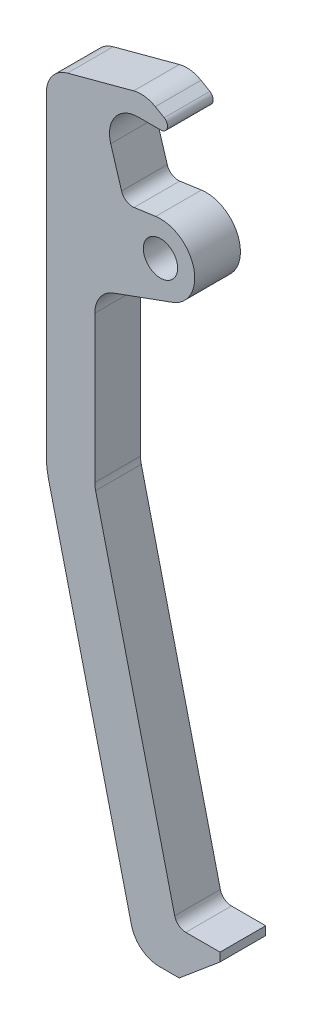
ISO-10303-21;
HEADER;
FILE_DESCRIPTION(('STEP AP214'),'2;1');
FILE_NAME('part.step','',(''),(''),'','','');
FILE_SCHEMA(('AUTOMOTIVE_DESIGN { 1 0 10303 214 1 1 1 1 }'));
ENDSEC;
DATA;
#1=APPLICATION_CONTEXT('core data for automotive mechanical design processes');
#2=APPLICATION_PROTOCOL_DEFINITION('international standard','automotive_design',2000,#1);
#3=PRODUCT_CONTEXT('',#1,'mechanical');
#4=PRODUCT('Part','Part','',(#3));
#5=PRODUCT_RELATED_PRODUCT_CATEGORY('part','',(#4));
#6=PRODUCT_DEFINITION_FORMATION('','',#4);
#7=PRODUCT_DEFINITION_CONTEXT('part definition',#1,'design');
#8=PRODUCT_DEFINITION('design','',#6,#7);
#9=PRODUCT_DEFINITION_SHAPE('','',#8);
#10=(LENGTH_UNIT() NAMED_UNIT(*) SI_UNIT(.MILLI.,.METRE.));
#11=(NAMED_UNIT(*) PLANE_ANGLE_UNIT() SI_UNIT($,.RADIAN.));
#12=(NAMED_UNIT(*) SI_UNIT($,.STERADIAN.) SOLID_ANGLE_UNIT());
#13=UNCERTAINTY_MEASURE_WITH_UNIT(LENGTH_MEASURE(1.E-05),#10,'distance_accuracy_value','');
#14=(GEOMETRIC_REPRESENTATION_CONTEXT(3) GLOBAL_UNCERTAINTY_ASSIGNED_CONTEXT((#13)) GLOBAL_UNIT_ASSIGNED_CONTEXT((#10,
#11,#12)) REPRESENTATION_CONTEXT('',''));
#15=CARTESIAN_POINT('',(0.,0.,0.));
#16=DIRECTION('',(0.,0.,1.));
#17=DIRECTION('',(1.,0.,0.));
#18=AXIS2_PLACEMENT_3D('',#15,#16,#17);
#19=CARTESIAN_POINT('',(-4.9,7.3919932770168,4.));
#20=DIRECTION('',(0.,0.,-1.));
#21=DIRECTION('',(-1.,0.,0.));
#22=AXIS2_PLACEMENT_3D('',#19,#20,#21);
#23=PLANE('',#22);
#24=CARTESIAN_POINT('',(-4.9,7.3919932770168,4.));
#25=DIRECTION('',(0.,0.,-1.));
#26=DIRECTION('',(-1.,0.,0.));
#27=AXIS2_PLACEMENT_3D('',#24,#25,#26);
#28=CIRCLE('',#27,2.);
#29=CARTESIAN_POINT('',(-4.6226908424842,5.41131166929741,4.));
#30=VERTEX_POINT('',#29);
#31=CARTESIAN_POINT('',(-6.81260951192607,6.80724986757133,4.));
#32=VERTEX_POINT('',#31);
#33=EDGE_CURVE('E284',#30,#32,#28,.T.);
#34=ORIENTED_EDGE('',*,*,#33,.T.);
#35=DIRECTION('',(-0.292371704722738,0.956304755963035,0.));
#36=VECTOR('',#35,1.);
#37=CARTESIAN_POINT('',(-6.81260951192607,6.80724986757133,4.));
#38=LINE('',#37,#36);
#39=CARTESIAN_POINT('',(-8.71302559262387,13.0232307813311,4.));
#40=VERTEX_POINT('',#39);
#41=EDGE_CURVE('E147',#32,#40,#38,.T.);
#42=ORIENTED_EDGE('',*,*,#41,.T.);
#43=CARTESIAN_POINT('',(-3.93150181280869,14.4850893049447,4.));
#44=DIRECTION('',(0.,0.,-1.));
#45=DIRECTION('',(-1.,0.,0.));
#46=AXIS2_PLACEMENT_3D('',#43,#44,#45);
#47=CIRCLE('',#46,5.);
#48=CARTESIAN_POINT('',(-3.93150181280869,19.4850893049447,4.));
#49=VERTEX_POINT('',#48);
#50=EDGE_CURVE('E350',#40,#49,#47,.T.);
#51=ORIENTED_EDGE('',*,*,#50,.T.);
#52=DIRECTION('',(1.,0.,0.));
#53=VECTOR('',#52,1.);
#54=CARTESIAN_POINT('',(-3.93150181280869,19.4850893049447,4.));
#55=LINE('',#54,#53);
#56=CARTESIAN_POINT('',(0.0684981871913097,19.4850893049447,4.));
#57=VERTEX_POINT('',#56);
#58=EDGE_CURVE('E369',#49,#57,#55,.T.);
#59=ORIENTED_EDGE('',*,*,#58,.T.);
#60=CARTESIAN_POINT('',(0.0684981871913078,20.6480042151237,4.));
#61=DIRECTION('',(0.,0.,1.));
#62=DIRECTION('',(1.,0.,0.));
#63=AXIS2_PLACEMENT_3D('',#60,#61,#62);
#64=CIRCLE('',#63,1.16291491017896);
#65=CARTESIAN_POINT('',(0.649955642280784,21.6551180697784,4.));
#66=VERTEX_POINT('',#65);
#67=EDGE_CURVE('E366',#57,#66,#64,.T.);
#68=ORIENTED_EDGE('',*,*,#67,.T.);
#69=DIRECTION('',(-0.86602540378444,0.499999999999997,0.));
#70=VECTOR('',#69,1.);
#71=CARTESIAN_POINT('',(0.649955642280784,21.6551180697784,4.));
#72=LINE('',#71,#70);
#73=CARTESIAN_POINT('',(-0.908890084531208,22.5551180697784,4.));
#74=VERTEX_POINT('',#73);
#75=EDGE_CURVE('E368',#66,#74,#72,.T.);
#76=ORIENTED_EDGE('',*,*,#75,.T.);
#77=CARTESIAN_POINT('',(-3.4088900845312,18.2249910508562,4.));
#78=DIRECTION('',(0.,0.,1.));
#79=DIRECTION('',(1.,0.,0.));
#80=AXIS2_PLACEMENT_3D('',#77,#78,#79);
#81=CIRCLE('',#80,5.);
#82=CARTESIAN_POINT('',(-4.70298531004382,23.0546201823015,4.));
#83=VERTEX_POINT('',#82);
#84=EDGE_CURVE('E371',#74,#83,#81,.T.);
#85=ORIENTED_EDGE('',*,*,#84,.T.);
#86=DIRECTION('',(-0.965925826289067,-0.258819045102525,0.));
#87=VECTOR('',#86,1.);
#88=CARTESIAN_POINT('',(-4.70298531004382,23.0546201823015,4.));
#89=LINE('',#88,#87);
#90=CARTESIAN_POINT('',(-16.2940952255126,19.9487916410712,4.));
#91=VERTEX_POINT('',#90);
#92=EDGE_CURVE('E377',#83,#91,#89,.T.);
#93=ORIENTED_EDGE('',*,*,#92,.T.);
#94=CARTESIAN_POINT('',(-15.,15.1191625096259,4.));
#95=DIRECTION('',(0.,0.,1.));
#96=DIRECTION('',(1.,0.,0.));
#97=AXIS2_PLACEMENT_3D('',#94,#95,#96);
#98=CIRCLE('',#97,5.);
#99=CARTESIAN_POINT('',(-20.,15.1191625096259,4.));
#100=VERTEX_POINT('',#99);
#101=EDGE_CURVE('E379',#91,#100,#98,.T.);
#102=ORIENTED_EDGE('',*,*,#101,.T.);
#103=DIRECTION('',(0.,-1.,0.));
#104=VECTOR('',#103,1.);
#105=CARTESIAN_POINT('',(-20.,15.1191625096259,4.));
#106=LINE('',#105,#104);
#107=CARTESIAN_POINT('',(-20.,-39.8808374903741,4.));
#108=VERTEX_POINT('',#107);
#109=EDGE_CURVE('E381',#100,#108,#106,.T.);
#110=ORIENTED_EDGE('',*,*,#109,.T.);
#111=CARTESIAN_POINT('',(-5.,-39.8808374903741,4.));
#112=DIRECTION('',(0.,0.,1.));
#113=DIRECTION('',(1.,0.,0.));
#114=AXIS2_PLACEMENT_3D('',#111,#112,#113);
#115=CIRCLE('',#114,15.);
#116=CARTESIAN_POINT('',(-19.5839110824137,-43.3893325438481,4.));
#117=VERTEX_POINT('',#116);
#118=EDGE_CURVE('E383',#108,#117,#115,.T.);
#119=ORIENTED_EDGE('',*,*,#118,.T.);
#120=DIRECTION('',(0.233899670231598,-0.972260738827579,0.));
#121=VECTOR('',#120,1.);
#122=CARTESIAN_POINT('',(-19.5839110824137,-43.3893325438481,4.));
#123=LINE('',#122,#121);
#124=CARTESIAN_POINT('',(-5.08213152805459,-103.669498351158,4.));
#125=VERTEX_POINT('',#124);
#126=EDGE_CURVE('E385',#117,#125,#123,.T.);
#127=ORIENTED_EDGE('',*,*,#126,.T.);
#128=CARTESIAN_POINT('',(-0.220827833916708,-102.5,4.));
#129=DIRECTION('',(0.,0.,1.));
#130=DIRECTION('',(1.,0.,0.));
#131=AXIS2_PLACEMENT_3D('',#128,#129,#130);
#132=CIRCLE('',#131,4.99999999999999);
#133=CARTESIAN_POINT('',(-0.220827833916708,-107.5,4.));
#134=VERTEX_POINT('',#133);
#135=EDGE_CURVE('E387',#125,#134,#132,.T.);
#136=ORIENTED_EDGE('',*,*,#135,.T.);
#137=DIRECTION('',(1.,0.,0.));
#138=VECTOR('',#137,1.);
#139=CARTESIAN_POINT('',(-0.220827833916708,-107.5,4.));
#140=LINE('',#139,#138);
#141=CARTESIAN_POINT('',(3.27917216608329,-107.5,4.));
#142=VERTEX_POINT('',#141);
#143=EDGE_CURVE('E389',#134,#142,#140,.T.);
#144=ORIENTED_EDGE('',*,*,#143,.T.);
#145=DIRECTION('',(0.766044443118981,0.642787609686535,0.));
#146=VECTOR('',#145,1.);
#147=CARTESIAN_POINT('',(3.27917216608329,-107.5,4.));
#148=LINE('',#147,#146);
#149=CARTESIAN_POINT('',(10.4296937216486,-101.5,4.));
#150=VERTEX_POINT('',#149);
#151=EDGE_CURVE('E391',#142,#150,#148,.T.);
#152=ORIENTED_EDGE('',*,*,#151,.T.);
#153=DIRECTION('',(0.,1.,0.));
#154=VECTOR('',#153,1.);
#155=CARTESIAN_POINT('',(10.4296937216486,-101.5,4.));
#156=LINE('',#155,#154);
#157=CARTESIAN_POINT('',(10.4296937216486,-100.,4.));
#158=VERTEX_POINT('',#157);
#159=EDGE_CURVE('E393',#150,#158,#156,.T.);
#160=ORIENTED_EDGE('',*,*,#159,.T.);
#161=DIRECTION('',(-1.,0.,0.));
#162=VECTOR('',#161,1.);
#163=CARTESIAN_POINT('',(10.4296937216486,-100.,4.));
#164=LINE('',#163,#162);
#165=CARTESIAN_POINT('',(4.42969372164859,-100.,4.));
#166=VERTEX_POINT('',#165);
#167=EDGE_CURVE('E395',#158,#166,#164,.T.);
#168=ORIENTED_EDGE('',*,*,#167,.T.);
#169=CARTESIAN_POINT('',(4.42969372164859,-98.,4.));
#170=DIRECTION('',(0.,0.,-1.));
#171=DIRECTION('',(-1.,0.,0.));
#172=AXIS2_PLACEMENT_3D('',#169,#170,#171);
#173=CIRCLE('',#172,2.);
#174=CARTESIAN_POINT('',(2.48517224399344,-98.4677993404632,4.));
#175=VERTEX_POINT('',#174);
#176=EDGE_CURVE('E397',#166,#175,#173,.T.);
#177=ORIENTED_EDGE('',*,*,#176,.T.);
#178=DIRECTION('',(-0.233899670231598,0.972260738827579,0.));
#179=VECTOR('',#178,1.);
#180=CARTESIAN_POINT('',(-11.3613036941379,-40.9115620339465,4.));
#181=LINE('',#180,#179);
#182=CARTESIAN_POINT('',(-11.3613036941379,-40.9115620339465,4.));
#183=VERTEX_POINT('',#182);
#184=EDGE_CURVE('E399',#175,#183,#181,.T.);
#185=ORIENTED_EDGE('',*,*,#184,.T.);
#186=CARTESIAN_POINT('',(-6.5,-39.7420636827885,4.));
#187=DIRECTION('',(0.,0.,-1.));
#188=DIRECTION('',(1.,0.,0.));
#189=AXIS2_PLACEMENT_3D('',#186,#187,#188);
#190=CIRCLE('',#189,5.);
#191=CARTESIAN_POINT('',(-11.5,-39.7420636827885,4.));
#192=VERTEX_POINT('',#191);
#193=EDGE_CURVE('E401',#183,#192,#190,.T.);
#194=ORIENTED_EDGE('',*,*,#193,.T.);
#195=DIRECTION('',(0.,1.,0.));
#196=VECTOR('',#195,1.);
#197=CARTESIAN_POINT('',(-11.5,-14.0717620199654,4.));
#198=LINE('',#197,#196);
#199=CARTESIAN_POINT('',(-11.5,-14.0717620199654,4.));
#200=VERTEX_POINT('',#199);
#201=EDGE_CURVE('E403',#192,#200,#198,.T.);
#202=ORIENTED_EDGE('',*,*,#201,.T.);
#203=CARTESIAN_POINT('',(-6.5,-14.0717620199654,4.));
#204=DIRECTION('',(0.,0.,-1.));
#205=DIRECTION('',(1.,0.,0.));
#206=AXIS2_PLACEMENT_3D('',#203,#204,#205);
#207=CIRCLE('',#206,5.);
#208=CARTESIAN_POINT('',(-8.21010071662837,-9.37329891603587,4.));
#209=VERTEX_POINT('',#208);
#210=EDGE_CURVE('E217',#200,#209,#207,.T.);
#211=ORIENTED_EDGE('',*,*,#210,.T.);
#212=DIRECTION('',(0.939692620785907,0.342020143325673,0.));
#213=VECTOR('',#212,1.);
#214=CARTESIAN_POINT('',(2.05212085995404,-5.63815572471544,4.));
#215=LINE('',#214,#213);
#216=CARTESIAN_POINT('',(2.05212085995404,-5.63815572471544,4.));
#217=VERTEX_POINT('',#216);
#218=EDGE_CURVE('E211',#209,#217,#215,.T.);
#219=ORIENTED_EDGE('',*,*,#218,.T.);
#220=CARTESIAN_POINT('',(0.,0.,4.));
#221=DIRECTION('',(0.,0.,1.));
#222=DIRECTION('',(-1.,0.,0.));
#223=AXIS2_PLACEMENT_3D('',#220,#221,#222);
#224=CIRCLE('',#223,6.);
#225=CARTESIAN_POINT('',(-0.831927472547396,5.94204482315818,4.));
#226=VERTEX_POINT('',#225);
#227=EDGE_CURVE('E215',#217,#226,#224,.T.);
#228=ORIENTED_EDGE('',*,*,#227,.T.);
#229=DIRECTION('',(-0.990340803859696,-0.1386545787579,0.));
#230=VECTOR('',#229,1.);
#231=CARTESIAN_POINT('',(-4.6226908424842,5.41131166929741,4.));
#232=LINE('',#231,#230);
#233=EDGE_CURVE('E53',#226,#30,#232,.T.);
#234=ORIENTED_EDGE('',*,*,#233,.T.);
#235=EDGE_LOOP('',(#34,#42,#51,#59,#68,#76,#85,#93,#102,#110,#119,#127,#136,#144,#152,#160,#168,
#177,#185,#194,#202,#211,#219,#228,#234));
#236=FACE_BOUND('',#235,.T.);
#237=CARTESIAN_POINT('',(0.,0.,4.));
#238=DIRECTION('',(0.,0.,1.));
#239=DIRECTION('',(1.,0.,0.));
#240=AXIS2_PLACEMENT_3D('',#237,#238,#239);
#241=CIRCLE('',#240,3.);
#242=CARTESIAN_POINT('',(3.,0.,4.));
#243=VERTEX_POINT('',#242);
#244=EDGE_CURVE('E239',#243,#243,#241,.T.);
#245=ORIENTED_EDGE('',*,*,#244,.F.);
#246=EDGE_LOOP('',(#245));
#247=FACE_BOUND('',#246,.T.);
#248=ADVANCED_FACE('F36',(#236,#247),#23,.F.);
#249=CARTESIAN_POINT('',(-4.9,7.3919932770168,-4.));
#250=DIRECTION('',(0.,0.,-1.));
#251=DIRECTION('',(-1.,0.,0.));
#252=AXIS2_PLACEMENT_3D('',#249,#250,#251);
#253=PLANE('',#252);
#254=CARTESIAN_POINT('',(-4.9,7.3919932770168,-4.));
#255=DIRECTION('',(0.,0.,-1.));
#256=DIRECTION('',(-1.,0.,0.));
#257=AXIS2_PLACEMENT_3D('',#254,#255,#256);
#258=CIRCLE('',#257,2.);
#259=CARTESIAN_POINT('',(-4.6226908424842,5.41131166929741,-4.));
#260=VERTEX_POINT('',#259);
#261=CARTESIAN_POINT('',(-6.81260951192607,6.80724986757133,-4.));
#262=VERTEX_POINT('',#261);
#263=EDGE_CURVE('E235',#260,#262,#258,.T.);
#264=ORIENTED_EDGE('',*,*,#263,.F.);
#265=DIRECTION('',(-0.990340803859696,-0.1386545787579,0.));
#266=VECTOR('',#265,1.);
#267=CARTESIAN_POINT('',(-4.6226908424842,5.41131166929741,-4.));
#268=LINE('',#267,#266);
#269=CARTESIAN_POINT('',(-0.831927472547396,5.94204482315818,-4.));
#270=VERTEX_POINT('',#269);
#271=EDGE_CURVE('E139',#270,#260,#268,.T.);
#272=ORIENTED_EDGE('',*,*,#271,.F.);
#273=CARTESIAN_POINT('',(0.,0.,-4.));
#274=DIRECTION('',(0.,0.,1.));
#275=DIRECTION('',(-1.,0.,0.));
#276=AXIS2_PLACEMENT_3D('',#273,#274,#275);
#277=CIRCLE('',#276,6.);
#278=CARTESIAN_POINT('',(2.05212085995404,-5.63815572471544,-4.));
#279=VERTEX_POINT('',#278);
#280=EDGE_CURVE('E133',#279,#270,#277,.T.);
#281=ORIENTED_EDGE('',*,*,#280,.F.);
#282=DIRECTION('',(0.939692620785907,0.342020143325673,0.));
#283=VECTOR('',#282,1.);
#284=CARTESIAN_POINT('',(2.05212085995404,-5.63815572471544,-4.));
#285=LINE('',#284,#283);
#286=CARTESIAN_POINT('',(-8.21010071662837,-9.37329891603587,-4.));
#287=VERTEX_POINT('',#286);
#288=EDGE_CURVE('E225',#287,#279,#285,.T.);
#289=ORIENTED_EDGE('',*,*,#288,.F.);
#290=CARTESIAN_POINT('',(-6.5,-14.0717620199654,-4.));
#291=DIRECTION('',(0.,0.,-1.));
#292=DIRECTION('',(1.,0.,0.));
#293=AXIS2_PLACEMENT_3D('',#290,#291,#292);
#294=CIRCLE('',#293,5.);
#295=CARTESIAN_POINT('',(-11.5,-14.0717620199654,-4.));
#296=VERTEX_POINT('',#295);
#297=EDGE_CURVE('E279',#296,#287,#294,.T.);
#298=ORIENTED_EDGE('',*,*,#297,.F.);
#299=DIRECTION('',(0.,1.,0.));
#300=VECTOR('',#299,1.);
#301=CARTESIAN_POINT('',(-11.5,-14.0717620199654,-4.));
#302=LINE('',#301,#300);
#303=CARTESIAN_POINT('',(-11.5,-39.7420636827885,-4.));
#304=VERTEX_POINT('',#303);
#305=EDGE_CURVE('E277',#304,#296,#302,.T.);
#306=ORIENTED_EDGE('',*,*,#305,.F.);
#307=CARTESIAN_POINT('',(-6.5,-39.7420636827885,-4.));
#308=DIRECTION('',(0.,0.,-1.));
#309=DIRECTION('',(1.,0.,0.));
#310=AXIS2_PLACEMENT_3D('',#307,#308,#309);
#311=CIRCLE('',#310,5.);
#312=CARTESIAN_POINT('',(-11.3613036941379,-40.9115620339465,-4.));
#313=VERTEX_POINT('',#312);
#314=EDGE_CURVE('E275',#313,#304,#311,.T.);
#315=ORIENTED_EDGE('',*,*,#314,.F.);
#316=DIRECTION('',(-0.233899670231598,0.972260738827579,0.));
#317=VECTOR('',#316,1.);
#318=CARTESIAN_POINT('',(-11.3613036941379,-40.9115620339465,-4.));
#319=LINE('',#318,#317);
#320=CARTESIAN_POINT('',(2.48517224399344,-98.4677993404632,-4.));
#321=VERTEX_POINT('',#320);
#322=EDGE_CURVE('E273',#321,#313,#319,.T.);
#323=ORIENTED_EDGE('',*,*,#322,.F.);
#324=CARTESIAN_POINT('',(4.42969372164859,-98.,-4.));
#325=DIRECTION('',(0.,0.,-1.));
#326=DIRECTION('',(-1.,0.,0.));
#327=AXIS2_PLACEMENT_3D('',#324,#325,#326);
#328=CIRCLE('',#327,2.);
#329=CARTESIAN_POINT('',(4.42969372164859,-100.,-4.));
#330=VERTEX_POINT('',#329);
#331=EDGE_CURVE('E271',#330,#321,#328,.T.);
#332=ORIENTED_EDGE('',*,*,#331,.F.);
#333=DIRECTION('',(-1.,0.,0.));
#334=VECTOR('',#333,1.);
#335=CARTESIAN_POINT('',(10.4296937216486,-100.,-4.));
#336=LINE('',#335,#334);
#337=CARTESIAN_POINT('',(10.4296937216486,-100.,-4.));
#338=VERTEX_POINT('',#337);
#339=EDGE_CURVE('E269',#338,#330,#336,.T.);
#340=ORIENTED_EDGE('',*,*,#339,.F.);
#341=DIRECTION('',(0.,1.,0.));
#342=VECTOR('',#341,1.);
#343=CARTESIAN_POINT('',(10.4296937216486,-101.5,-4.));
#344=LINE('',#343,#342);
#345=CARTESIAN_POINT('',(10.4296937216486,-101.5,-4.));
#346=VERTEX_POINT('',#345);
#347=EDGE_CURVE('E267',#346,#338,#344,.T.);
#348=ORIENTED_EDGE('',*,*,#347,.F.);
#349=DIRECTION('',(0.766044443118981,0.642787609686535,0.));
#350=VECTOR('',#349,1.);
#351=CARTESIAN_POINT('',(3.27917216608329,-107.5,-4.));
#352=LINE('',#351,#350);
#353=CARTESIAN_POINT('',(3.27917216608329,-107.5,-4.));
#354=VERTEX_POINT('',#353);
#355=EDGE_CURVE('E265',#354,#346,#352,.T.);
#356=ORIENTED_EDGE('',*,*,#355,.F.);
#357=DIRECTION('',(1.,0.,0.));
#358=VECTOR('',#357,1.);
#359=CARTESIAN_POINT('',(-0.220827833916708,-107.5,-4.));
#360=LINE('',#359,#358);
#361=CARTESIAN_POINT('',(-0.220827833916708,-107.5,-4.));
#362=VERTEX_POINT('',#361);
#363=EDGE_CURVE('E263',#362,#354,#360,.T.);
#364=ORIENTED_EDGE('',*,*,#363,.F.);
#365=CARTESIAN_POINT('',(-0.220827833916708,-102.5,-4.));
#366=DIRECTION('',(0.,0.,1.));
#367=DIRECTION('',(1.,0.,0.));
#368=AXIS2_PLACEMENT_3D('',#365,#366,#367);
#369=CIRCLE('',#368,4.99999999999999);
#370=CARTESIAN_POINT('',(-5.08213152805459,-103.669498351158,-4.));
#371=VERTEX_POINT('',#370);
#372=EDGE_CURVE('E261',#371,#362,#369,.T.);
#373=ORIENTED_EDGE('',*,*,#372,.F.);
#374=DIRECTION('',(0.233899670231598,-0.972260738827579,0.));
#375=VECTOR('',#374,1.);
#376=CARTESIAN_POINT('',(-19.5839110824137,-43.3893325438481,-4.));
#377=LINE('',#376,#375);
#378=CARTESIAN_POINT('',(-19.5839110824137,-43.3893325438481,-4.));
#379=VERTEX_POINT('',#378);
#380=EDGE_CURVE('E259',#379,#371,#377,.T.);
#381=ORIENTED_EDGE('',*,*,#380,.F.);
#382=CARTESIAN_POINT('',(-5.,-39.8808374903741,-4.));
#383=DIRECTION('',(0.,0.,1.));
#384=DIRECTION('',(1.,0.,0.));
#385=AXIS2_PLACEMENT_3D('',#382,#383,#384);
#386=CIRCLE('',#385,15.);
#387=CARTESIAN_POINT('',(-20.,-39.8808374903741,-4.));
#388=VERTEX_POINT('',#387);
#389=EDGE_CURVE('E257',#388,#379,#386,.T.);
#390=ORIENTED_EDGE('',*,*,#389,.F.);
#391=DIRECTION('',(0.,-1.,0.));
#392=VECTOR('',#391,1.);
#393=CARTESIAN_POINT('',(-20.,15.1191625096259,-4.));
#394=LINE('',#393,#392);
#395=CARTESIAN_POINT('',(-20.,15.1191625096259,-4.));
#396=VERTEX_POINT('',#395);
#397=EDGE_CURVE('E255',#396,#388,#394,.T.);
#398=ORIENTED_EDGE('',*,*,#397,.F.);
#399=CARTESIAN_POINT('',(-15.,15.1191625096259,-4.));
#400=DIRECTION('',(0.,0.,1.));
#401=DIRECTION('',(1.,0.,0.));
#402=AXIS2_PLACEMENT_3D('',#399,#400,#401);
#403=CIRCLE('',#402,5.);
#404=CARTESIAN_POINT('',(-16.2940952255126,19.9487916410712,-4.));
#405=VERTEX_POINT('',#404);
#406=EDGE_CURVE('E253',#405,#396,#403,.T.);
#407=ORIENTED_EDGE('',*,*,#406,.F.);
#408=DIRECTION('',(-0.965925826289067,-0.258819045102525,0.));
#409=VECTOR('',#408,1.);
#410=CARTESIAN_POINT('',(-4.70298531004382,23.0546201823015,-4.));
#411=LINE('',#410,#409);
#412=CARTESIAN_POINT('',(-4.70298531004382,23.0546201823015,-4.));
#413=VERTEX_POINT('',#412);
#414=EDGE_CURVE('E251',#413,#405,#411,.T.);
#415=ORIENTED_EDGE('',*,*,#414,.F.);
#416=CARTESIAN_POINT('',(-3.4088900845312,18.2249910508562,-4.));
#417=DIRECTION('',(0.,0.,1.));
#418=DIRECTION('',(1.,0.,0.));
#419=AXIS2_PLACEMENT_3D('',#416,#417,#418);
#420=CIRCLE('',#419,5.);
#421=CARTESIAN_POINT('',(-0.908890084531208,22.5551180697784,-4.));
#422=VERTEX_POINT('',#421);
#423=EDGE_CURVE('E249',#422,#413,#420,.T.);
#424=ORIENTED_EDGE('',*,*,#423,.F.);
#425=DIRECTION('',(-0.86602540378444,0.499999999999997,0.));
#426=VECTOR('',#425,1.);
#427=CARTESIAN_POINT('',(0.649955642280784,21.6551180697784,-4.));
#428=LINE('',#427,#426);
#429=CARTESIAN_POINT('',(0.649955642280784,21.6551180697784,-4.));
#430=VERTEX_POINT('',#429);
#431=EDGE_CURVE('E247',#430,#422,#428,.T.);
#432=ORIENTED_EDGE('',*,*,#431,.F.);
#433=CARTESIAN_POINT('',(0.0684981871913078,20.6480042151237,-4.));
#434=DIRECTION('',(0.,0.,1.));
#435=DIRECTION('',(1.,0.,0.));
#436=AXIS2_PLACEMENT_3D('',#433,#434,#435);
#437=CIRCLE('',#436,1.16291491017896);
#438=CARTESIAN_POINT('',(0.0684981871913097,19.4850893049447,-4.));
#439=VERTEX_POINT('',#438);
#440=EDGE_CURVE('E245',#439,#430,#437,.T.);
#441=ORIENTED_EDGE('',*,*,#440,.F.);
#442=DIRECTION('',(1.,0.,0.));
#443=VECTOR('',#442,1.);
#444=CARTESIAN_POINT('',(-3.93150181280869,19.4850893049447,-4.));
#445=LINE('',#444,#443);
#446=CARTESIAN_POINT('',(-3.93150181280869,19.4850893049447,-4.));
#447=VERTEX_POINT('',#446);
#448=EDGE_CURVE('E243',#447,#439,#445,.T.);
#449=ORIENTED_EDGE('',*,*,#448,.F.);
#450=CARTESIAN_POINT('',(-3.93150181280869,14.4850893049447,-4.));
#451=DIRECTION('',(0.,0.,-1.));
#452=DIRECTION('',(-1.,0.,0.));
#453=AXIS2_PLACEMENT_3D('',#450,#451,#452);
#454=CIRCLE('',#453,5.);
#455=CARTESIAN_POINT('',(-8.71302559262387,13.0232307813311,-4.));
#456=VERTEX_POINT('',#455);
#457=EDGE_CURVE('E241',#456,#447,#454,.T.);
#458=ORIENTED_EDGE('',*,*,#457,.F.);
#459=DIRECTION('',(-0.292371704722738,0.956304755963035,0.));
#460=VECTOR('',#459,1.);
#461=CARTESIAN_POINT('',(-6.81260951192607,6.80724986757133,-4.));
#462=LINE('',#461,#460);
#463=EDGE_CURVE('E238',#262,#456,#462,.T.);
#464=ORIENTED_EDGE('',*,*,#463,.F.);
#465=EDGE_LOOP('',(#264,#272,#281,#289,#298,#306,#315,#323,#332,#340,#348,#356,#364,#373,#381,
#390,#398,#407,#415,#424,#432,#441,#449,#458,#464));
#466=FACE_BOUND('',#465,.T.);
#467=CARTESIAN_POINT('',(0.,0.,-4.));
#468=DIRECTION('',(0.,0.,1.));
#469=DIRECTION('',(1.,0.,0.));
#470=AXIS2_PLACEMENT_3D('',#467,#468,#469);
#471=CIRCLE('',#470,3.);
#472=CARTESIAN_POINT('',(3.,0.,-4.));
#473=VERTEX_POINT('',#472);
#474=EDGE_CURVE('E719',#473,#473,#471,.T.);
#475=ORIENTED_EDGE('',*,*,#474,.T.);
#476=EDGE_LOOP('',(#475));
#477=FACE_BOUND('',#476,.T.);
#478=ADVANCED_FACE('F354',(#466,#477),#253,.T.);
#479=CARTESIAN_POINT('',(-4.9,7.3919932770168,4.));
#480=DIRECTION('',(0.,0.,-1.));
#481=DIRECTION('',(-1.,0.,0.));
#482=AXIS2_PLACEMENT_3D('',#479,#480,#481);
#483=CYLINDRICAL_SURFACE('',#482,2.);
#484=ORIENTED_EDGE('',*,*,#263,.T.);
#485=DIRECTION('',(0.,0.,-1.));
#486=VECTOR('',#485,1.);
#487=CARTESIAN_POINT('',(-6.81260951192607,6.80724986757133,4.));
#488=LINE('',#487,#486);
#489=EDGE_CURVE('E11',#32,#262,#488,.T.);
#490=ORIENTED_EDGE('',*,*,#489,.F.);
#491=ORIENTED_EDGE('',*,*,#33,.F.);
#492=DIRECTION('',(0.,0.,-1.));
#493=VECTOR('',#492,1.);
#494=CARTESIAN_POINT('',(-4.6226908424842,5.41131166929741,4.));
#495=LINE('',#494,#493);
#496=EDGE_CURVE('E231',#30,#260,#495,.T.);
#497=ORIENTED_EDGE('',*,*,#496,.T.);
#498=EDGE_LOOP('',(#484,#490,#491,#497));
#499=FACE_BOUND('',#498,.T.);
#500=ADVANCED_FACE('F38',(#499),#483,.F.);
#501=CARTESIAN_POINT('',(-6.81260951192607,6.80724986757133,4.));
#502=DIRECTION('',(-0.956304755963035,-0.292371704722738,0.));
#503=DIRECTION('',(0.292371704722738,-0.956304755963035,0.));
#504=AXIS2_PLACEMENT_3D('',#501,#502,#503);
#505=PLANE('',#504);
#506=ORIENTED_EDGE('',*,*,#463,.T.);
#507=DIRECTION('',(0.,0.,-1.));
#508=VECTOR('',#507,1.);
#509=CARTESIAN_POINT('',(-8.71302559262387,13.0232307813311,4.));
#510=LINE('',#509,#508);
#511=EDGE_CURVE('E45',#40,#456,#510,.T.);
#512=ORIENTED_EDGE('',*,*,#511,.F.);
#513=ORIENTED_EDGE('',*,*,#41,.F.);
#514=ORIENTED_EDGE('',*,*,#489,.T.);
#515=EDGE_LOOP('',(#506,#512,#513,#514));
#516=FACE_BOUND('',#515,.T.);
#517=ADVANCED_FACE('F437',(#516),#505,.F.);
#518=CARTESIAN_POINT('',(-3.93150181280869,14.4850893049447,4.));
#519=DIRECTION('',(0.,0.,-1.));
#520=DIRECTION('',(-1.,0.,0.));
#521=AXIS2_PLACEMENT_3D('',#518,#519,#520);
#522=CYLINDRICAL_SURFACE('',#521,5.);
#523=ORIENTED_EDGE('',*,*,#457,.T.);
#524=DIRECTION('',(0.,0.,-1.));
#525=VECTOR('',#524,1.);
#526=CARTESIAN_POINT('',(-3.93150181280869,19.4850893049447,4.));
#527=LINE('',#526,#525);
#528=EDGE_CURVE('E342',#49,#447,#527,.T.);
#529=ORIENTED_EDGE('',*,*,#528,.F.);
#530=ORIENTED_EDGE('',*,*,#50,.F.);
#531=ORIENTED_EDGE('',*,*,#511,.T.);
#532=EDGE_LOOP('',(#523,#529,#530,#531));
#533=FACE_BOUND('',#532,.T.);
#534=ADVANCED_FACE('F348',(#533),#522,.F.);
#535=CARTESIAN_POINT('',(-3.93150181280869,19.4850893049447,4.));
#536=DIRECTION('',(0.,1.,0.));
#537=DIRECTION('',(0.,0.,1.));
#538=AXIS2_PLACEMENT_3D('',#535,#536,#537);
#539=PLANE('',#538);
#540=ORIENTED_EDGE('',*,*,#448,.T.);
#541=DIRECTION('',(0.,0.,-1.));
#542=VECTOR('',#541,1.);
#543=CARTESIAN_POINT('',(0.0684981871913097,19.4850893049447,4.));
#544=LINE('',#543,#542);
#545=EDGE_CURVE('E339',#57,#439,#544,.T.);
#546=ORIENTED_EDGE('',*,*,#545,.F.);
#547=ORIENTED_EDGE('',*,*,#58,.F.);
#548=ORIENTED_EDGE('',*,*,#528,.T.);
#549=EDGE_LOOP('',(#540,#546,#547,#548));
#550=FACE_BOUND('',#549,.T.);
#551=ADVANCED_FACE('F360',(#550),#539,.F.);
#552=CARTESIAN_POINT('',(0.0684981871913078,20.6480042151237,4.));
#553=DIRECTION('',(0.,0.,-1.));
#554=DIRECTION('',(-1.,0.,0.));
#555=AXIS2_PLACEMENT_3D('',#552,#553,#554);
#556=CYLINDRICAL_SURFACE('',#555,1.16291491017896);
#557=ORIENTED_EDGE('',*,*,#440,.T.);
#558=DIRECTION('',(0.,0.,-1.));
#559=VECTOR('',#558,1.);
#560=CARTESIAN_POINT('',(0.649955642280784,21.6551180697784,4.));
#561=LINE('',#560,#559);
#562=EDGE_CURVE('E336',#66,#430,#561,.T.);
#563=ORIENTED_EDGE('',*,*,#562,.F.);
#564=ORIENTED_EDGE('',*,*,#67,.F.);
#565=ORIENTED_EDGE('',*,*,#545,.T.);
#566=EDGE_LOOP('',(#557,#563,#564,#565));
#567=FACE_BOUND('',#566,.T.);
#568=ADVANCED_FACE('F364',(#567),#556,.T.);
#569=CARTESIAN_POINT('',(0.649955642280784,21.6551180697784,4.));
#570=DIRECTION('',(-0.499999999999997,-0.86602540378444,0.));
#571=DIRECTION('',(0.86602540378444,-0.499999999999997,0.));
#572=AXIS2_PLACEMENT_3D('',#569,#570,#571);
#573=PLANE('',#572);
#574=ORIENTED_EDGE('',*,*,#431,.T.);
#575=DIRECTION('',(0.,0.,-1.));
#576=VECTOR('',#575,1.);
#577=CARTESIAN_POINT('',(-0.908890084531208,22.5551180697784,4.));
#578=LINE('',#577,#576);
#579=EDGE_CURVE('E333',#74,#422,#578,.T.);
#580=ORIENTED_EDGE('',*,*,#579,.F.);
#581=ORIENTED_EDGE('',*,*,#75,.F.);
#582=ORIENTED_EDGE('',*,*,#562,.T.);
#583=EDGE_LOOP('',(#574,#580,#581,#582));
#584=FACE_BOUND('',#583,.T.);
#585=ADVANCED_FACE('F450',(#584),#573,.F.);
#586=CARTESIAN_POINT('',(-3.4088900845312,18.2249910508562,4.));
#587=DIRECTION('',(0.,0.,-1.));
#588=DIRECTION('',(-1.,0.,0.));
#589=AXIS2_PLACEMENT_3D('',#586,#587,#588);
#590=CYLINDRICAL_SURFACE('',#589,5.);
#591=ORIENTED_EDGE('',*,*,#423,.T.);
#592=DIRECTION('',(0.,0.,-1.));
#593=VECTOR('',#592,1.);
#594=CARTESIAN_POINT('',(-4.70298531004382,23.0546201823015,4.));
#595=LINE('',#594,#593);
#596=EDGE_CURVE('E330',#83,#413,#595,.T.);
#597=ORIENTED_EDGE('',*,*,#596,.F.);
#598=ORIENTED_EDGE('',*,*,#84,.F.);
#599=ORIENTED_EDGE('',*,*,#579,.T.);
#600=EDGE_LOOP('',(#591,#597,#598,#599));
#601=FACE_BOUND('',#600,.T.);
#602=ADVANCED_FACE('F453',(#601),#590,.T.);
#603=CARTESIAN_POINT('',(-4.70298531004382,23.0546201823015,4.));
#604=DIRECTION('',(0.258819045102525,-0.965925826289067,0.));
#605=DIRECTION('',(0.965925826289067,0.258819045102525,0.));
#606=AXIS2_PLACEMENT_3D('',#603,#604,#605);
#607=PLANE('',#606);
#608=ORIENTED_EDGE('',*,*,#414,.T.);
#609=DIRECTION('',(0.,0.,-1.));
#610=VECTOR('',#609,1.);
#611=CARTESIAN_POINT('',(-16.2940952255126,19.9487916410712,4.));
#612=LINE('',#611,#610);
#613=EDGE_CURVE('E327',#91,#405,#612,.T.);
#614=ORIENTED_EDGE('',*,*,#613,.F.);
#615=ORIENTED_EDGE('',*,*,#92,.F.);
#616=ORIENTED_EDGE('',*,*,#596,.T.);
#617=EDGE_LOOP('',(#608,#614,#615,#616));
#618=FACE_BOUND('',#617,.T.);
#619=ADVANCED_FACE('F457',(#618),#607,.F.);
#620=CARTESIAN_POINT('',(-15.,15.1191625096259,4.));
#621=DIRECTION('',(0.,0.,-1.));
#622=DIRECTION('',(-1.,0.,0.));
#623=AXIS2_PLACEMENT_3D('',#620,#621,#622);
#624=CYLINDRICAL_SURFACE('',#623,5.);
#625=ORIENTED_EDGE('',*,*,#406,.T.);
#626=DIRECTION('',(0.,0.,-1.));
#627=VECTOR('',#626,1.);
#628=CARTESIAN_POINT('',(-20.,15.1191625096259,4.));
#629=LINE('',#628,#627);
#630=EDGE_CURVE('E324',#100,#396,#629,.T.);
#631=ORIENTED_EDGE('',*,*,#630,.F.);
#632=ORIENTED_EDGE('',*,*,#101,.F.);
#633=ORIENTED_EDGE('',*,*,#613,.T.);
#634=EDGE_LOOP('',(#625,#631,#632,#633));
#635=FACE_BOUND('',#634,.T.);
#636=ADVANCED_FACE('F461',(#635),#624,.T.);
#637=CARTESIAN_POINT('',(-20.,15.1191625096259,4.));
#638=DIRECTION('',(1.,0.,0.));
#639=DIRECTION('',(0.,0.,-1.));
#640=AXIS2_PLACEMENT_3D('',#637,#638,#639);
#641=PLANE('',#640);
#642=ORIENTED_EDGE('',*,*,#397,.T.);
#643=DIRECTION('',(0.,0.,-1.));
#644=VECTOR('',#643,1.);
#645=CARTESIAN_POINT('',(-20.,-39.8808374903741,4.));
#646=LINE('',#645,#644);
#647=EDGE_CURVE('E321',#108,#388,#646,.T.);
#648=ORIENTED_EDGE('',*,*,#647,.F.);
#649=ORIENTED_EDGE('',*,*,#109,.F.);
#650=ORIENTED_EDGE('',*,*,#630,.T.);
#651=EDGE_LOOP('',(#642,#648,#649,#650));
#652=FACE_BOUND('',#651,.T.);
#653=ADVANCED_FACE('F465',(#652),#641,.F.);
#654=CARTESIAN_POINT('',(-5.,-39.8808374903741,4.));
#655=DIRECTION('',(0.,0.,-1.));
#656=DIRECTION('',(-1.,0.,0.));
#657=AXIS2_PLACEMENT_3D('',#654,#655,#656);
#658=CYLINDRICAL_SURFACE('',#657,15.);
#659=ORIENTED_EDGE('',*,*,#389,.T.);
#660=DIRECTION('',(0.,0.,-1.));
#661=VECTOR('',#660,1.);
#662=CARTESIAN_POINT('',(-19.5839110824137,-43.3893325438481,4.));
#663=LINE('',#662,#661);
#664=EDGE_CURVE('E318',#117,#379,#663,.T.);
#665=ORIENTED_EDGE('',*,*,#664,.F.);
#666=ORIENTED_EDGE('',*,*,#118,.F.);
#667=ORIENTED_EDGE('',*,*,#647,.T.);
#668=EDGE_LOOP('',(#659,#665,#666,#667));
#669=FACE_BOUND('',#668,.T.);
#670=ADVANCED_FACE('F469',(#669),#658,.T.);
#671=CARTESIAN_POINT('',(-19.5839110824137,-43.3893325438481,4.));
#672=DIRECTION('',(0.972260738827579,0.233899670231598,0.));
#673=DIRECTION('',(-0.233899670231598,0.972260738827579,0.));
#674=AXIS2_PLACEMENT_3D('',#671,#672,#673);
#675=PLANE('',#674);
#676=ORIENTED_EDGE('',*,*,#380,.T.);
#677=DIRECTION('',(0.,0.,-1.));
#678=VECTOR('',#677,1.);
#679=CARTESIAN_POINT('',(-5.08213152805459,-103.669498351158,4.));
#680=LINE('',#679,#678);
#681=EDGE_CURVE('E315',#125,#371,#680,.T.);
#682=ORIENTED_EDGE('',*,*,#681,.F.);
#683=ORIENTED_EDGE('',*,*,#126,.F.);
#684=ORIENTED_EDGE('',*,*,#664,.T.);
#685=EDGE_LOOP('',(#676,#682,#683,#684));
#686=FACE_BOUND('',#685,.T.);
#687=ADVANCED_FACE('F473',(#686),#675,.F.);
#688=CARTESIAN_POINT('',(-0.220827833916708,-102.5,4.));
#689=DIRECTION('',(0.,0.,-1.));
#690=DIRECTION('',(-1.,0.,0.));
#691=AXIS2_PLACEMENT_3D('',#688,#689,#690);
#692=CYLINDRICAL_SURFACE('',#691,4.99999999999999);
#693=ORIENTED_EDGE('',*,*,#372,.T.);
#694=DIRECTION('',(0.,0.,-1.));
#695=VECTOR('',#694,1.);
#696=CARTESIAN_POINT('',(-0.220827833916708,-107.5,4.));
#697=LINE('',#696,#695);
#698=EDGE_CURVE('E312',#134,#362,#697,.T.);
#699=ORIENTED_EDGE('',*,*,#698,.F.);
#700=ORIENTED_EDGE('',*,*,#135,.F.);
#701=ORIENTED_EDGE('',*,*,#681,.T.);
#702=EDGE_LOOP('',(#693,#699,#700,#701));
#703=FACE_BOUND('',#702,.T.);
#704=ADVANCED_FACE('F477',(#703),#692,.T.);
#705=CARTESIAN_POINT('',(-0.220827833916708,-107.5,4.));
#706=DIRECTION('',(0.,1.,0.));
#707=DIRECTION('',(-1.,0.,0.));
#708=AXIS2_PLACEMENT_3D('',#705,#706,#707);
#709=PLANE('',#708);
#710=ORIENTED_EDGE('',*,*,#363,.T.);
#711=DIRECTION('',(0.,0.,-1.));
#712=VECTOR('',#711,1.);
#713=CARTESIAN_POINT('',(3.27917216608329,-107.5,4.));
#714=LINE('',#713,#712);
#715=EDGE_CURVE('E309',#142,#354,#714,.T.);
#716=ORIENTED_EDGE('',*,*,#715,.F.);
#717=ORIENTED_EDGE('',*,*,#143,.F.);
#718=ORIENTED_EDGE('',*,*,#698,.T.);
#719=EDGE_LOOP('',(#710,#716,#717,#718));
#720=FACE_BOUND('',#719,.T.);
#721=ADVANCED_FACE('F481',(#720),#709,.F.);
#722=CARTESIAN_POINT('',(3.27917216608329,-107.5,4.));
#723=DIRECTION('',(-0.642787609686535,0.766044443118981,0.));
#724=DIRECTION('',(-0.766044443118981,-0.642787609686535,0.));
#725=AXIS2_PLACEMENT_3D('',#722,#723,#724);
#726=PLANE('',#725);
#727=ORIENTED_EDGE('',*,*,#355,.T.);
#728=DIRECTION('',(0.,0.,-1.));
#729=VECTOR('',#728,1.);
#730=CARTESIAN_POINT('',(10.4296937216486,-101.5,4.));
#731=LINE('',#730,#729);
#732=EDGE_CURVE('E306',#150,#346,#731,.T.);
#733=ORIENTED_EDGE('',*,*,#732,.F.);
#734=ORIENTED_EDGE('',*,*,#151,.F.);
#735=ORIENTED_EDGE('',*,*,#715,.T.);
#736=EDGE_LOOP('',(#727,#733,#734,#735));
#737=FACE_BOUND('',#736,.T.);
#738=ADVANCED_FACE('F485',(#737),#726,.F.);
#739=CARTESIAN_POINT('',(10.4296937216486,-101.5,4.));
#740=DIRECTION('',(-1.,0.,0.));
#741=DIRECTION('',(0.,-1.,0.));
#742=AXIS2_PLACEMENT_3D('',#739,#740,#741);
#743=PLANE('',#742);
#744=ORIENTED_EDGE('',*,*,#347,.T.);
#745=DIRECTION('',(0.,0.,-1.));
#746=VECTOR('',#745,1.);
#747=CARTESIAN_POINT('',(10.4296937216486,-100.,4.));
#748=LINE('',#747,#746);
#749=EDGE_CURVE('E303',#158,#338,#748,.T.);
#750=ORIENTED_EDGE('',*,*,#749,.F.);
#751=ORIENTED_EDGE('',*,*,#159,.F.);
#752=ORIENTED_EDGE('',*,*,#732,.T.);
#753=EDGE_LOOP('',(#744,#750,#751,#752));
#754=FACE_BOUND('',#753,.T.);
#755=ADVANCED_FACE('F489',(#754),#743,.F.);
#756=CARTESIAN_POINT('',(10.4296937216486,-100.,4.));
#757=DIRECTION('',(0.,-1.,0.));
#758=DIRECTION('',(0.,0.,-1.));
#759=AXIS2_PLACEMENT_3D('',#756,#757,#758);
#760=PLANE('',#759);
#761=ORIENTED_EDGE('',*,*,#339,.T.);
#762=DIRECTION('',(0.,0.,-1.));
#763=VECTOR('',#762,1.);
#764=CARTESIAN_POINT('',(4.42969372164859,-100.,4.));
#765=LINE('',#764,#763);
#766=EDGE_CURVE('E300',#166,#330,#765,.T.);
#767=ORIENTED_EDGE('',*,*,#766,.F.);
#768=ORIENTED_EDGE('',*,*,#167,.F.);
#769=ORIENTED_EDGE('',*,*,#749,.T.);
#770=EDGE_LOOP('',(#761,#767,#768,#769));
#771=FACE_BOUND('',#770,.T.);
#772=ADVANCED_FACE('F493',(#771),#760,.F.);
#773=CARTESIAN_POINT('',(4.42969372164859,-98.,4.));
#774=DIRECTION('',(0.,0.,-1.));
#775=DIRECTION('',(-1.,0.,0.));
#776=AXIS2_PLACEMENT_3D('',#773,#774,#775);
#777=CYLINDRICAL_SURFACE('',#776,2.);
#778=ORIENTED_EDGE('',*,*,#331,.T.);
#779=DIRECTION('',(0.,0.,-1.));
#780=VECTOR('',#779,1.);
#781=CARTESIAN_POINT('',(2.48517224399344,-98.4677993404632,4.));
#782=LINE('',#781,#780);
#783=EDGE_CURVE('E297',#175,#321,#782,.T.);
#784=ORIENTED_EDGE('',*,*,#783,.F.);
#785=ORIENTED_EDGE('',*,*,#176,.F.);
#786=ORIENTED_EDGE('',*,*,#766,.T.);
#787=EDGE_LOOP('',(#778,#784,#785,#786));
#788=FACE_BOUND('',#787,.T.);
#789=ADVANCED_FACE('F497',(#788),#777,.F.);
#790=CARTESIAN_POINT('',(-11.3613036941379,-40.9115620339465,4.));
#791=DIRECTION('',(-0.972260738827579,-0.233899670231598,0.));
#792=DIRECTION('',(0.233899670231598,-0.972260738827579,0.));
#793=AXIS2_PLACEMENT_3D('',#790,#791,#792);
#794=PLANE('',#793);
#795=ORIENTED_EDGE('',*,*,#322,.T.);
#796=DIRECTION('',(0.,0.,-1.));
#797=VECTOR('',#796,1.);
#798=CARTESIAN_POINT('',(-11.3613036941379,-40.9115620339465,4.));
#799=LINE('',#798,#797);
#800=EDGE_CURVE('E294',#183,#313,#799,.T.);
#801=ORIENTED_EDGE('',*,*,#800,.F.);
#802=ORIENTED_EDGE('',*,*,#184,.F.);
#803=ORIENTED_EDGE('',*,*,#783,.T.);
#804=EDGE_LOOP('',(#795,#801,#802,#803));
#805=FACE_BOUND('',#804,.T.);
#806=ADVANCED_FACE('F501',(#805),#794,.F.);
#807=CARTESIAN_POINT('',(-6.5,-39.7420636827885,4.));
#808=DIRECTION('',(0.,0.,-1.));
#809=DIRECTION('',(-1.,0.,0.));
#810=AXIS2_PLACEMENT_3D('',#807,#808,#809);
#811=CYLINDRICAL_SURFACE('',#810,5.);
#812=ORIENTED_EDGE('',*,*,#314,.T.);
#813=DIRECTION('',(0.,0.,-1.));
#814=VECTOR('',#813,1.);
#815=CARTESIAN_POINT('',(-11.5,-39.7420636827885,4.));
#816=LINE('',#815,#814);
#817=EDGE_CURVE('E291',#192,#304,#816,.T.);
#818=ORIENTED_EDGE('',*,*,#817,.F.);
#819=ORIENTED_EDGE('',*,*,#193,.F.);
#820=ORIENTED_EDGE('',*,*,#800,.T.);
#821=EDGE_LOOP('',(#812,#818,#819,#820));
#822=FACE_BOUND('',#821,.T.);
#823=ADVANCED_FACE('F505',(#822),#811,.F.);
#824=CARTESIAN_POINT('',(-11.5,-14.0717620199654,4.));
#825=DIRECTION('',(-1.,0.,0.));
#826=DIRECTION('',(0.,0.,1.));
#827=AXIS2_PLACEMENT_3D('',#824,#825,#826);
#828=PLANE('',#827);
#829=ORIENTED_EDGE('',*,*,#305,.T.);
#830=DIRECTION('',(0.,0.,-1.));
#831=VECTOR('',#830,1.);
#832=CARTESIAN_POINT('',(-11.5,-14.0717620199654,4.));
#833=LINE('',#832,#831);
#834=EDGE_CURVE('E288',#200,#296,#833,.T.);
#835=ORIENTED_EDGE('',*,*,#834,.F.);
#836=ORIENTED_EDGE('',*,*,#201,.F.);
#837=ORIENTED_EDGE('',*,*,#817,.T.);
#838=EDGE_LOOP('',(#829,#835,#836,#837));
#839=FACE_BOUND('',#838,.T.);
#840=ADVANCED_FACE('F409',(#839),#828,.F.);
#841=CARTESIAN_POINT('',(-6.5,-14.0717620199654,4.));
#842=DIRECTION('',(0.,0.,-1.));
#843=DIRECTION('',(-1.,0.,0.));
#844=AXIS2_PLACEMENT_3D('',#841,#842,#843);
#845=CYLINDRICAL_SURFACE('',#844,5.);
#846=ORIENTED_EDGE('',*,*,#297,.T.);
#847=DIRECTION('',(0.,0.,-1.));
#848=VECTOR('',#847,1.);
#849=CARTESIAN_POINT('',(-8.21010071662837,-9.37329891603587,4.));
#850=LINE('',#849,#848);
#851=EDGE_CURVE('E226',#209,#287,#850,.T.);
#852=ORIENTED_EDGE('',*,*,#851,.F.);
#853=ORIENTED_EDGE('',*,*,#210,.F.);
#854=ORIENTED_EDGE('',*,*,#834,.T.);
#855=EDGE_LOOP('',(#846,#852,#853,#854));
#856=FACE_BOUND('',#855,.T.);
#857=ADVANCED_FACE('F413',(#856),#845,.F.);
#858=CARTESIAN_POINT('',(2.05212085995404,-5.63815572471544,4.));
#859=DIRECTION('',(-0.342020143325673,0.939692620785907,0.));
#860=DIRECTION('',(-0.939692620785907,-0.342020143325673,0.));
#861=AXIS2_PLACEMENT_3D('',#858,#859,#860);
#862=PLANE('',#861);
#863=ORIENTED_EDGE('',*,*,#288,.T.);
#864=DIRECTION('',(0.,0.,-1.));
#865=VECTOR('',#864,1.);
#866=CARTESIAN_POINT('',(2.05212085995404,-5.63815572471544,4.));
#867=LINE('',#866,#865);
#868=EDGE_CURVE('E222',#217,#279,#867,.T.);
#869=ORIENTED_EDGE('',*,*,#868,.F.);
#870=ORIENTED_EDGE('',*,*,#218,.F.);
#871=ORIENTED_EDGE('',*,*,#851,.T.);
#872=EDGE_LOOP('',(#863,#869,#870,#871));
#873=FACE_BOUND('',#872,.T.);
#874=ADVANCED_FACE('F223',(#873),#862,.F.);
#875=CARTESIAN_POINT('',(0.,0.,4.));
#876=DIRECTION('',(0.,0.,-1.));
#877=DIRECTION('',(-1.,0.,0.));
#878=AXIS2_PLACEMENT_3D('',#875,#876,#877);
#879=CYLINDRICAL_SURFACE('',#878,6.);
#880=ORIENTED_EDGE('',*,*,#280,.T.);
#881=DIRECTION('',(0.,0.,-1.));
#882=VECTOR('',#881,1.);
#883=CARTESIAN_POINT('',(-0.831927472547396,5.94204482315818,4.));
#884=LINE('',#883,#882);
#885=EDGE_CURVE('E227',#226,#270,#884,.T.);
#886=ORIENTED_EDGE('',*,*,#885,.F.);
#887=ORIENTED_EDGE('',*,*,#227,.F.);
#888=ORIENTED_EDGE('',*,*,#868,.T.);
#889=EDGE_LOOP('',(#880,#886,#887,#888));
#890=FACE_BOUND('',#889,.T.);
#891=ADVANCED_FACE('F229',(#890),#879,.T.);
#892=CARTESIAN_POINT('',(-4.6226908424842,5.41131166929741,4.));
#893=DIRECTION('',(0.1386545787579,-0.990340803859696,0.));
#894=DIRECTION('',(0.990340803859696,0.1386545787579,0.));
#895=AXIS2_PLACEMENT_3D('',#892,#893,#894);
#896=PLANE('',#895);
#897=ORIENTED_EDGE('',*,*,#271,.T.);
#898=ORIENTED_EDGE('',*,*,#496,.F.);
#899=ORIENTED_EDGE('',*,*,#233,.F.);
#900=ORIENTED_EDGE('',*,*,#885,.T.);
#901=EDGE_LOOP('',(#897,#898,#899,#900));
#902=FACE_BOUND('',#901,.T.);
#903=ADVANCED_FACE('F417',(#902),#896,.F.);
#904=CARTESIAN_POINT('',(0.,0.,4.));
#905=DIRECTION('',(0.,0.,-1.));
#906=DIRECTION('',(-1.,0.,0.));
#907=AXIS2_PLACEMENT_3D('',#904,#905,#906);
#908=CYLINDRICAL_SURFACE('',#907,3.);
#909=ORIENTED_EDGE('',*,*,#244,.T.);
#910=EDGE_LOOP('',(#909));
#911=FACE_BOUND('',#910,.T.);
#912=ORIENTED_EDGE('',*,*,#474,.F.);
#913=EDGE_LOOP('',(#912));
#914=FACE_BOUND('',#913,.T.);
#915=ADVANCED_FACE('F419',(#911,#914),#908,.F.);
#916=CLOSED_SHELL('',(#248,#478,#500,#517,#534,#551,#568,#585,#602,#619,#636,#653,#670,#687,
#704,#721,#738,#755,#772,#789,#806,#823,#840,#857,#874,#891,#903,#915));
#917=MANIFOLD_SOLID_BREP('B2',#916);
#918=ADVANCED_BREP_SHAPE_REPRESENTATION('',(#18,#917),#14);
#919=SHAPE_DEFINITION_REPRESENTATION(#9,#918);
ENDSEC;
END-ISO-10303-21;
